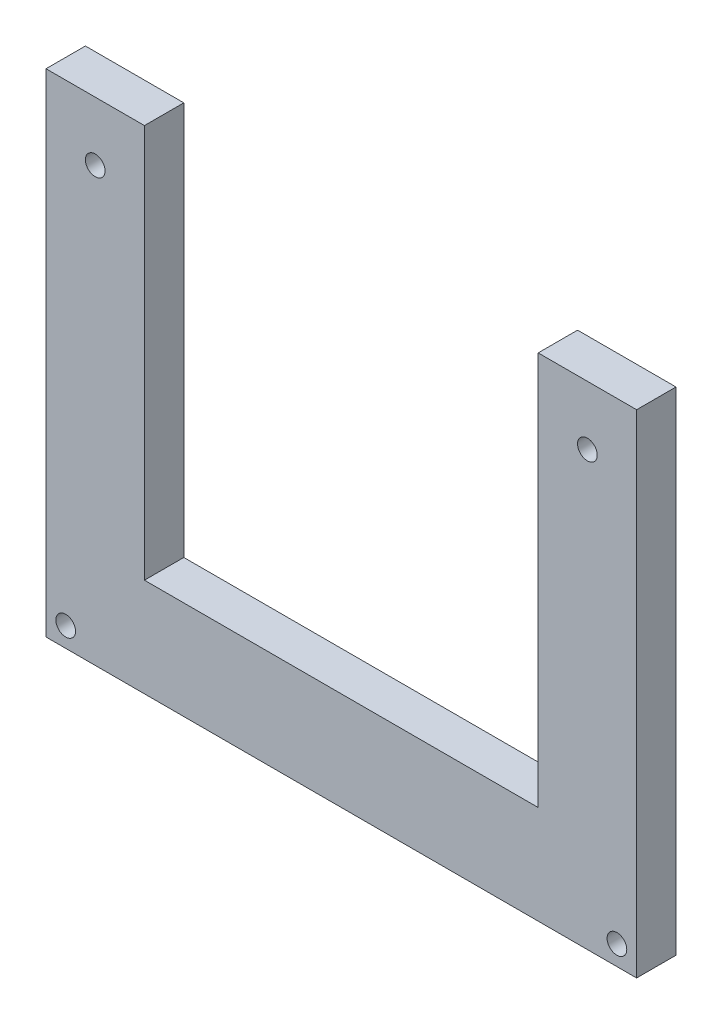
ISO-10303-21;
HEADER;
FILE_DESCRIPTION(('STEP AP214'),'2;1');
FILE_NAME('part.step','',(''),(''),'','','');
FILE_SCHEMA(('AUTOMOTIVE_DESIGN { 1 0 10303 214 1 1 1 1 }'));
ENDSEC;
DATA;
#1=APPLICATION_CONTEXT('core data for automotive mechanical design processes');
#2=APPLICATION_PROTOCOL_DEFINITION('international standard','automotive_design',2000,#1);
#3=PRODUCT_CONTEXT('',#1,'mechanical');
#4=PRODUCT('Part','Part','',(#3));
#5=PRODUCT_RELATED_PRODUCT_CATEGORY('part','',(#4));
#6=PRODUCT_DEFINITION_FORMATION('','',#4);
#7=PRODUCT_DEFINITION_CONTEXT('part definition',#1,'design');
#8=PRODUCT_DEFINITION('design','',#6,#7);
#9=PRODUCT_DEFINITION_SHAPE('','',#8);
#10=(LENGTH_UNIT() NAMED_UNIT(*) SI_UNIT(.MILLI.,.METRE.));
#11=(NAMED_UNIT(*) PLANE_ANGLE_UNIT() SI_UNIT($,.RADIAN.));
#12=(NAMED_UNIT(*) SI_UNIT($,.STERADIAN.) SOLID_ANGLE_UNIT());
#13=UNCERTAINTY_MEASURE_WITH_UNIT(LENGTH_MEASURE(1.E-05),#10,'distance_accuracy_value','');
#14=(GEOMETRIC_REPRESENTATION_CONTEXT(3) GLOBAL_UNCERTAINTY_ASSIGNED_CONTEXT((#13)) GLOBAL_UNIT_ASSIGNED_CONTEXT((#10,
#11,#12)) REPRESENTATION_CONTEXT('',''));
#15=CARTESIAN_POINT('',(0.,0.,0.));
#16=DIRECTION('',(0.,0.,1.));
#17=DIRECTION('',(1.,0.,0.));
#18=AXIS2_PLACEMENT_3D('',#15,#16,#17);
#19=CARTESIAN_POINT('',(50.,0.,20.));
#20=DIRECTION('',(0.,-1.,0.));
#21=DIRECTION('',(0.,0.,-1.));
#22=AXIS2_PLACEMENT_3D('',#19,#20,#21);
#23=PLANE('',#22);
#24=DIRECTION('',(-1.,0.,0.));
#25=VECTOR('',#24,1.);
#26=CARTESIAN_POINT('',(50.,0.,0.));
#27=LINE('',#26,#25);
#28=CARTESIAN_POINT('',(50.,0.,0.));
#29=VERTEX_POINT('',#28);
#30=CARTESIAN_POINT('',(0.,0.,0.));
#31=VERTEX_POINT('',#30);
#32=EDGE_CURVE('E134',#29,#31,#27,.T.);
#33=ORIENTED_EDGE('',*,*,#32,.T.);
#34=DIRECTION('',(0.,0.,-1.));
#35=VECTOR('',#34,1.);
#36=CARTESIAN_POINT('',(0.,0.,20.));
#37=LINE('',#36,#35);
#38=CARTESIAN_POINT('',(0.,0.,20.));
#39=VERTEX_POINT('',#38);
#40=EDGE_CURVE('E11',#39,#31,#37,.T.);
#41=ORIENTED_EDGE('',*,*,#40,.F.);
#42=DIRECTION('',(-1.,0.,0.));
#43=VECTOR('',#42,1.);
#44=CARTESIAN_POINT('',(50.,0.,20.));
#45=LINE('',#44,#43);
#46=CARTESIAN_POINT('',(50.,0.,20.));
#47=VERTEX_POINT('',#46);
#48=EDGE_CURVE('E149',#47,#39,#45,.T.);
#49=ORIENTED_EDGE('',*,*,#48,.F.);
#50=DIRECTION('',(0.,0.,-1.));
#51=VECTOR('',#50,1.);
#52=CARTESIAN_POINT('',(50.,0.,20.));
#53=LINE('',#52,#51);
#54=EDGE_CURVE('E130',#47,#29,#53,.T.);
#55=ORIENTED_EDGE('',*,*,#54,.T.);
#56=EDGE_LOOP('',(#33,#41,#49,#55));
#57=FACE_BOUND('',#56,.T.);
#58=ADVANCED_FACE('F38',(#57),#23,.F.);
#59=CARTESIAN_POINT('',(0.,0.,20.));
#60=DIRECTION('',(1.,0.,0.));
#61=DIRECTION('',(0.,1.,0.));
#62=AXIS2_PLACEMENT_3D('',#59,#60,#61);
#63=PLANE('',#62);
#64=DIRECTION('',(0.,-1.,0.));
#65=VECTOR('',#64,1.);
#66=CARTESIAN_POINT('',(0.,0.,0.));
#67=LINE('',#66,#65);
#68=CARTESIAN_POINT('',(0.,-250.,0.));
#69=VERTEX_POINT('',#68);
#70=EDGE_CURVE('E137',#31,#69,#67,.T.);
#71=ORIENTED_EDGE('',*,*,#70,.T.);
#72=DIRECTION('',(0.,0.,-1.));
#73=VECTOR('',#72,1.);
#74=CARTESIAN_POINT('',(0.,-250.,20.));
#75=LINE('',#74,#73);
#76=CARTESIAN_POINT('',(0.,-250.,20.));
#77=VERTEX_POINT('',#76);
#78=EDGE_CURVE('E46',#77,#69,#75,.T.);
#79=ORIENTED_EDGE('',*,*,#78,.F.);
#80=DIRECTION('',(0.,-1.,0.));
#81=VECTOR('',#80,1.);
#82=CARTESIAN_POINT('',(0.,0.,20.));
#83=LINE('',#82,#81);
#84=EDGE_CURVE('E97',#39,#77,#83,.T.);
#85=ORIENTED_EDGE('',*,*,#84,.F.);
#86=ORIENTED_EDGE('',*,*,#40,.T.);
#87=EDGE_LOOP('',(#71,#79,#85,#86));
#88=FACE_BOUND('',#87,.T.);
#89=ADVANCED_FACE('F230',(#88),#63,.F.);
#90=CARTESIAN_POINT('',(0.,-250.,20.));
#91=DIRECTION('',(0.,1.,0.));
#92=DIRECTION('',(0.,0.,1.));
#93=AXIS2_PLACEMENT_3D('',#90,#91,#92);
#94=PLANE('',#93);
#95=DIRECTION('',(1.,0.,0.));
#96=VECTOR('',#95,1.);
#97=CARTESIAN_POINT('',(0.,-250.,0.));
#98=LINE('',#97,#96);
#99=CARTESIAN_POINT('',(300.,-250.,0.));
#100=VERTEX_POINT('',#99);
#101=EDGE_CURVE('E140',#69,#100,#98,.T.);
#102=ORIENTED_EDGE('',*,*,#101,.T.);
#103=DIRECTION('',(0.,0.,-1.));
#104=VECTOR('',#103,1.);
#105=CARTESIAN_POINT('',(300.,-250.,20.));
#106=LINE('',#105,#104);
#107=CARTESIAN_POINT('',(300.,-250.,20.));
#108=VERTEX_POINT('',#107);
#109=EDGE_CURVE('E156',#108,#100,#106,.T.);
#110=ORIENTED_EDGE('',*,*,#109,.F.);
#111=DIRECTION('',(1.,0.,0.));
#112=VECTOR('',#111,1.);
#113=CARTESIAN_POINT('',(0.,-250.,20.));
#114=LINE('',#113,#112);
#115=EDGE_CURVE('E164',#77,#108,#114,.T.);
#116=ORIENTED_EDGE('',*,*,#115,.F.);
#117=ORIENTED_EDGE('',*,*,#78,.T.);
#118=EDGE_LOOP('',(#102,#110,#116,#117));
#119=FACE_BOUND('',#118,.T.);
#120=ADVANCED_FACE('F162',(#119),#94,.F.);
#121=CARTESIAN_POINT('',(300.,0.,20.));
#122=DIRECTION('',(-1.,0.,0.));
#123=DIRECTION('',(0.,0.,1.));
#124=AXIS2_PLACEMENT_3D('',#121,#122,#123);
#125=PLANE('',#124);
#126=DIRECTION('',(0.,1.,0.));
#127=VECTOR('',#126,1.);
#128=CARTESIAN_POINT('',(300.,0.,0.));
#129=LINE('',#128,#127);
#130=CARTESIAN_POINT('',(300.,0.,0.));
#131=VERTEX_POINT('',#130);
#132=EDGE_CURVE('E142',#100,#131,#129,.T.);
#133=ORIENTED_EDGE('',*,*,#132,.T.);
#134=DIRECTION('',(0.,0.,-1.));
#135=VECTOR('',#134,1.);
#136=CARTESIAN_POINT('',(300.,0.,20.));
#137=LINE('',#136,#135);
#138=CARTESIAN_POINT('',(300.,0.,20.));
#139=VERTEX_POINT('',#138);
#140=EDGE_CURVE('E153',#139,#131,#137,.T.);
#141=ORIENTED_EDGE('',*,*,#140,.F.);
#142=DIRECTION('',(0.,1.,0.));
#143=VECTOR('',#142,1.);
#144=CARTESIAN_POINT('',(300.,0.,20.));
#145=LINE('',#144,#143);
#146=EDGE_CURVE('E176',#108,#139,#145,.T.);
#147=ORIENTED_EDGE('',*,*,#146,.F.);
#148=ORIENTED_EDGE('',*,*,#109,.T.);
#149=EDGE_LOOP('',(#133,#141,#147,#148));
#150=FACE_BOUND('',#149,.T.);
#151=ADVANCED_FACE('F172',(#150),#125,.F.);
#152=CARTESIAN_POINT('',(250.,0.,20.));
#153=DIRECTION('',(0.,-1.,0.));
#154=DIRECTION('',(0.,0.,-1.));
#155=AXIS2_PLACEMENT_3D('',#152,#153,#154);
#156=PLANE('',#155);
#157=DIRECTION('',(-1.,0.,0.));
#158=VECTOR('',#157,1.);
#159=CARTESIAN_POINT('',(250.,0.,0.));
#160=LINE('',#159,#158);
#161=CARTESIAN_POINT('',(250.,0.,0.));
#162=VERTEX_POINT('',#161);
#163=EDGE_CURVE('E144',#131,#162,#160,.T.);
#164=ORIENTED_EDGE('',*,*,#163,.T.);
#165=DIRECTION('',(0.,0.,-1.));
#166=VECTOR('',#165,1.);
#167=CARTESIAN_POINT('',(250.,0.,20.));
#168=LINE('',#167,#166);
#169=CARTESIAN_POINT('',(250.,0.,20.));
#170=VERTEX_POINT('',#169);
#171=EDGE_CURVE('E125',#170,#162,#168,.T.);
#172=ORIENTED_EDGE('',*,*,#171,.F.);
#173=DIRECTION('',(-1.,0.,0.));
#174=VECTOR('',#173,1.);
#175=CARTESIAN_POINT('',(250.,0.,20.));
#176=LINE('',#175,#174);
#177=EDGE_CURVE('E116',#139,#170,#176,.T.);
#178=ORIENTED_EDGE('',*,*,#177,.F.);
#179=ORIENTED_EDGE('',*,*,#140,.T.);
#180=EDGE_LOOP('',(#164,#172,#178,#179));
#181=FACE_BOUND('',#180,.T.);
#182=ADVANCED_FACE('F175',(#181),#156,.F.);
#183=CARTESIAN_POINT('',(250.,-200.,20.));
#184=DIRECTION('',(1.,0.,0.));
#185=DIRECTION('',(0.,1.,0.));
#186=AXIS2_PLACEMENT_3D('',#183,#184,#185);
#187=PLANE('',#186);
#188=DIRECTION('',(0.,-1.,0.));
#189=VECTOR('',#188,1.);
#190=CARTESIAN_POINT('',(250.,-200.,0.));
#191=LINE('',#190,#189);
#192=CARTESIAN_POINT('',(250.,-200.,0.));
#193=VERTEX_POINT('',#192);
#194=EDGE_CURVE('E124',#162,#193,#191,.T.);
#195=ORIENTED_EDGE('',*,*,#194,.T.);
#196=DIRECTION('',(0.,0.,-1.));
#197=VECTOR('',#196,1.);
#198=CARTESIAN_POINT('',(250.,-200.,20.));
#199=LINE('',#198,#197);
#200=CARTESIAN_POINT('',(250.,-200.,20.));
#201=VERTEX_POINT('',#200);
#202=EDGE_CURVE('E121',#201,#193,#199,.T.);
#203=ORIENTED_EDGE('',*,*,#202,.F.);
#204=DIRECTION('',(0.,-1.,0.));
#205=VECTOR('',#204,1.);
#206=CARTESIAN_POINT('',(250.,-200.,20.));
#207=LINE('',#206,#205);
#208=EDGE_CURVE('E110',#170,#201,#207,.T.);
#209=ORIENTED_EDGE('',*,*,#208,.F.);
#210=ORIENTED_EDGE('',*,*,#171,.T.);
#211=EDGE_LOOP('',(#195,#203,#209,#210));
#212=FACE_BOUND('',#211,.T.);
#213=ADVANCED_FACE('F122',(#212),#187,.F.);
#214=CARTESIAN_POINT('',(250.,-200.,20.));
#215=DIRECTION('',(0.,-1.,0.));
#216=DIRECTION('',(1.,0.,0.));
#217=AXIS2_PLACEMENT_3D('',#214,#215,#216);
#218=PLANE('',#217);
#219=DIRECTION('',(-1.,0.,0.));
#220=VECTOR('',#219,1.);
#221=CARTESIAN_POINT('',(250.,-200.,0.));
#222=LINE('',#221,#220);
#223=CARTESIAN_POINT('',(50.,-200.,0.));
#224=VERTEX_POINT('',#223);
#225=EDGE_CURVE('E83',#193,#224,#222,.T.);
#226=ORIENTED_EDGE('',*,*,#225,.T.);
#227=DIRECTION('',(0.,0.,-1.));
#228=VECTOR('',#227,1.);
#229=CARTESIAN_POINT('',(50.,-200.,20.));
#230=LINE('',#229,#228);
#231=CARTESIAN_POINT('',(50.,-200.,20.));
#232=VERTEX_POINT('',#231);
#233=EDGE_CURVE('E126',#232,#224,#230,.T.);
#234=ORIENTED_EDGE('',*,*,#233,.F.);
#235=DIRECTION('',(-1.,0.,0.));
#236=VECTOR('',#235,1.);
#237=CARTESIAN_POINT('',(250.,-200.,20.));
#238=LINE('',#237,#236);
#239=EDGE_CURVE('E114',#201,#232,#238,.T.);
#240=ORIENTED_EDGE('',*,*,#239,.F.);
#241=ORIENTED_EDGE('',*,*,#202,.T.);
#242=EDGE_LOOP('',(#226,#234,#240,#241));
#243=FACE_BOUND('',#242,.T.);
#244=ADVANCED_FACE('F128',(#243),#218,.F.);
#245=CARTESIAN_POINT('',(50.,-200.,20.));
#246=DIRECTION('',(-1.,0.,0.));
#247=DIRECTION('',(0.,-1.,0.));
#248=AXIS2_PLACEMENT_3D('',#245,#246,#247);
#249=PLANE('',#248);
#250=DIRECTION('',(0.,1.,0.));
#251=VECTOR('',#250,1.);
#252=CARTESIAN_POINT('',(50.,-200.,0.));
#253=LINE('',#252,#251);
#254=EDGE_CURVE('E89',#224,#29,#253,.T.);
#255=ORIENTED_EDGE('',*,*,#254,.T.);
#256=ORIENTED_EDGE('',*,*,#54,.F.);
#257=DIRECTION('',(0.,1.,0.));
#258=VECTOR('',#257,1.);
#259=CARTESIAN_POINT('',(50.,-200.,20.));
#260=LINE('',#259,#258);
#261=EDGE_CURVE('E54',#232,#47,#260,.T.);
#262=ORIENTED_EDGE('',*,*,#261,.F.);
#263=ORIENTED_EDGE('',*,*,#233,.T.);
#264=EDGE_LOOP('',(#255,#256,#262,#263));
#265=FACE_BOUND('',#264,.T.);
#266=ADVANCED_FACE('F237',(#265),#249,.F.);
#267=CARTESIAN_POINT('',(0.,0.,20.));
#268=DIRECTION('',(0.,0.,1.));
#269=DIRECTION('',(1.,0.,0.));
#270=AXIS2_PLACEMENT_3D('',#267,#268,#269);
#271=PLANE('',#270);
#272=CARTESIAN_POINT('',(290.,-240.,20.));
#273=DIRECTION('',(0.,0.,1.));
#274=DIRECTION('',(1.,0.,0.));
#275=AXIS2_PLACEMENT_3D('',#272,#273,#274);
#276=CIRCLE('',#275,4.99999999999999);
#277=CARTESIAN_POINT('',(295.,-240.,20.));
#278=VERTEX_POINT('',#277);
#279=EDGE_CURVE('E200',#278,#278,#276,.F.);
#280=ORIENTED_EDGE('',*,*,#279,.T.);
#281=EDGE_LOOP('',(#280));
#282=FACE_BOUND('',#281,.T.);
#283=CARTESIAN_POINT('',(10.0000000000001,-240.,20.));
#284=DIRECTION('',(0.,0.,1.));
#285=DIRECTION('',(1.,0.,0.));
#286=AXIS2_PLACEMENT_3D('',#283,#284,#285);
#287=CIRCLE('',#286,5.);
#288=CARTESIAN_POINT('',(15.0000000000001,-240.,20.));
#289=VERTEX_POINT('',#288);
#290=EDGE_CURVE('E194',#289,#289,#287,.F.);
#291=ORIENTED_EDGE('',*,*,#290,.T.);
#292=EDGE_LOOP('',(#291));
#293=FACE_BOUND('',#292,.T.);
#294=CARTESIAN_POINT('',(25.,-30.,20.));
#295=DIRECTION('',(0.,0.,1.));
#296=DIRECTION('',(1.,0.,0.));
#297=AXIS2_PLACEMENT_3D('',#294,#295,#296);
#298=CIRCLE('',#297,5.);
#299=CARTESIAN_POINT('',(30.,-30.,20.));
#300=VERTEX_POINT('',#299);
#301=EDGE_CURVE('E185',#300,#300,#298,.T.);
#302=ORIENTED_EDGE('',*,*,#301,.F.);
#303=EDGE_LOOP('',(#302));
#304=FACE_BOUND('',#303,.T.);
#305=CARTESIAN_POINT('',(275.,-30.,20.));
#306=DIRECTION('',(0.,0.,1.));
#307=DIRECTION('',(1.,0.,0.));
#308=AXIS2_PLACEMENT_3D('',#305,#306,#307);
#309=CIRCLE('',#308,4.99999999999999);
#310=CARTESIAN_POINT('',(280.,-30.,20.));
#311=VERTEX_POINT('',#310);
#312=EDGE_CURVE('E186',#311,#311,#309,.T.);
#313=ORIENTED_EDGE('',*,*,#312,.F.);
#314=EDGE_LOOP('',(#313));
#315=FACE_BOUND('',#314,.T.);
#316=ORIENTED_EDGE('',*,*,#48,.T.);
#317=ORIENTED_EDGE('',*,*,#84,.T.);
#318=ORIENTED_EDGE('',*,*,#115,.T.);
#319=ORIENTED_EDGE('',*,*,#146,.T.);
#320=ORIENTED_EDGE('',*,*,#177,.T.);
#321=ORIENTED_EDGE('',*,*,#208,.T.);
#322=ORIENTED_EDGE('',*,*,#239,.T.);
#323=ORIENTED_EDGE('',*,*,#261,.T.);
#324=EDGE_LOOP('',(#316,#317,#318,#319,#320,#321,#322,#323));
#325=FACE_BOUND('',#324,.T.);
#326=ADVANCED_FACE('F112',(#282,#293,#304,#315,#325),#271,.T.);
#327=CARTESIAN_POINT('',(0.,0.,0.));
#328=DIRECTION('',(0.,0.,1.));
#329=DIRECTION('',(1.,0.,0.));
#330=AXIS2_PLACEMENT_3D('',#327,#328,#329);
#331=PLANE('',#330);
#332=CARTESIAN_POINT('',(290.,-240.,0.));
#333=DIRECTION('',(0.,0.,-1.));
#334=DIRECTION('',(-1.,0.,0.));
#335=AXIS2_PLACEMENT_3D('',#332,#333,#334);
#336=CIRCLE('',#335,4.99999999999999);
#337=CARTESIAN_POINT('',(285.,-240.,0.));
#338=VERTEX_POINT('',#337);
#339=EDGE_CURVE('E189',#338,#338,#336,.T.);
#340=ORIENTED_EDGE('',*,*,#339,.F.);
#341=EDGE_LOOP('',(#340));
#342=FACE_BOUND('',#341,.T.);
#343=CARTESIAN_POINT('',(10.0000000000001,-240.,0.));
#344=DIRECTION('',(0.,0.,-1.));
#345=DIRECTION('',(1.,0.,0.));
#346=AXIS2_PLACEMENT_3D('',#343,#344,#345);
#347=CIRCLE('',#346,5.);
#348=CARTESIAN_POINT('',(15.0000000000001,-240.,0.));
#349=VERTEX_POINT('',#348);
#350=EDGE_CURVE('E197',#349,#349,#347,.T.);
#351=ORIENTED_EDGE('',*,*,#350,.F.);
#352=EDGE_LOOP('',(#351));
#353=FACE_BOUND('',#352,.T.);
#354=CARTESIAN_POINT('',(25.,-30.,0.));
#355=DIRECTION('',(0.,0.,1.));
#356=DIRECTION('',(1.,0.,0.));
#357=AXIS2_PLACEMENT_3D('',#354,#355,#356);
#358=CIRCLE('',#357,5.);
#359=CARTESIAN_POINT('',(30.,-30.,0.));
#360=VERTEX_POINT('',#359);
#361=EDGE_CURVE('E138',#360,#360,#358,.F.);
#362=ORIENTED_EDGE('',*,*,#361,.F.);
#363=EDGE_LOOP('',(#362));
#364=FACE_BOUND('',#363,.T.);
#365=CARTESIAN_POINT('',(275.,-30.,0.));
#366=DIRECTION('',(0.,0.,1.));
#367=DIRECTION('',(1.,0.,0.));
#368=AXIS2_PLACEMENT_3D('',#365,#366,#367);
#369=CIRCLE('',#368,4.99999999999999);
#370=CARTESIAN_POINT('',(280.,-30.,0.));
#371=VERTEX_POINT('',#370);
#372=EDGE_CURVE('E182',#371,#371,#369,.F.);
#373=ORIENTED_EDGE('',*,*,#372,.F.);
#374=EDGE_LOOP('',(#373));
#375=FACE_BOUND('',#374,.T.);
#376=ORIENTED_EDGE('',*,*,#32,.F.);
#377=ORIENTED_EDGE('',*,*,#254,.F.);
#378=ORIENTED_EDGE('',*,*,#225,.F.);
#379=ORIENTED_EDGE('',*,*,#194,.F.);
#380=ORIENTED_EDGE('',*,*,#163,.F.);
#381=ORIENTED_EDGE('',*,*,#132,.F.);
#382=ORIENTED_EDGE('',*,*,#101,.F.);
#383=ORIENTED_EDGE('',*,*,#70,.F.);
#384=EDGE_LOOP('',(#376,#377,#378,#379,#380,#381,#382,#383));
#385=FACE_BOUND('',#384,.T.);
#386=ADVANCED_FACE('F168',(#342,#353,#364,#375,#385),#331,.F.);
#387=CARTESIAN_POINT('',(275.,-30.,-0.001000000000001));
#388=DIRECTION('',(0.,0.,1.));
#389=DIRECTION('',(1.,0.,0.));
#390=AXIS2_PLACEMENT_3D('',#387,#388,#389);
#391=CYLINDRICAL_SURFACE('',#390,4.99999999999999);
#392=ORIENTED_EDGE('',*,*,#312,.T.);
#393=EDGE_LOOP('',(#392));
#394=FACE_BOUND('',#393,.T.);
#395=ORIENTED_EDGE('',*,*,#372,.T.);
#396=EDGE_LOOP('',(#395));
#397=FACE_BOUND('',#396,.T.);
#398=ADVANCED_FACE('F210',(#394,#397),#391,.F.);
#399=CARTESIAN_POINT('',(25.,-30.,-0.001000000000001));
#400=DIRECTION('',(0.,0.,1.));
#401=DIRECTION('',(1.,0.,0.));
#402=AXIS2_PLACEMENT_3D('',#399,#400,#401);
#403=CYLINDRICAL_SURFACE('',#402,5.);
#404=ORIENTED_EDGE('',*,*,#301,.T.);
#405=EDGE_LOOP('',(#404));
#406=FACE_BOUND('',#405,.T.);
#407=ORIENTED_EDGE('',*,*,#361,.T.);
#408=EDGE_LOOP('',(#407));
#409=FACE_BOUND('',#408,.T.);
#410=ADVANCED_FACE('F219',(#406,#409),#403,.F.);
#411=CARTESIAN_POINT('',(10.0000000000001,-240.,20.001));
#412=DIRECTION('',(0.,0.,-1.));
#413=DIRECTION('',(-1.,0.,0.));
#414=AXIS2_PLACEMENT_3D('',#411,#412,#413);
#415=CYLINDRICAL_SURFACE('',#414,5.);
#416=ORIENTED_EDGE('',*,*,#290,.F.);
#417=EDGE_LOOP('',(#416));
#418=FACE_BOUND('',#417,.T.);
#419=ORIENTED_EDGE('',*,*,#350,.T.);
#420=EDGE_LOOP('',(#419));
#421=FACE_BOUND('',#420,.T.);
#422=ADVANCED_FACE('F225',(#418,#421),#415,.F.);
#423=CARTESIAN_POINT('',(290.,-240.,20.001));
#424=DIRECTION('',(0.,0.,-1.));
#425=DIRECTION('',(-1.,0.,0.));
#426=AXIS2_PLACEMENT_3D('',#423,#424,#425);
#427=CYLINDRICAL_SURFACE('',#426,4.99999999999999);
#428=ORIENTED_EDGE('',*,*,#279,.F.);
#429=EDGE_LOOP('',(#428));
#430=FACE_BOUND('',#429,.T.);
#431=ORIENTED_EDGE('',*,*,#339,.T.);
#432=EDGE_LOOP('',(#431));
#433=FACE_BOUND('',#432,.T.);
#434=ADVANCED_FACE('F206',(#430,#433),#427,.F.);
#435=CLOSED_SHELL('',(#58,#89,#120,#151,#182,#213,#244,#266,#326,#386,#398,#410,#422,#434));
#436=MANIFOLD_SOLID_BREP('B2',#435);
#437=ADVANCED_BREP_SHAPE_REPRESENTATION('',(#18,#436),#14);
#438=SHAPE_DEFINITION_REPRESENTATION(#9,#437);
ENDSEC;
END-ISO-10303-21;
